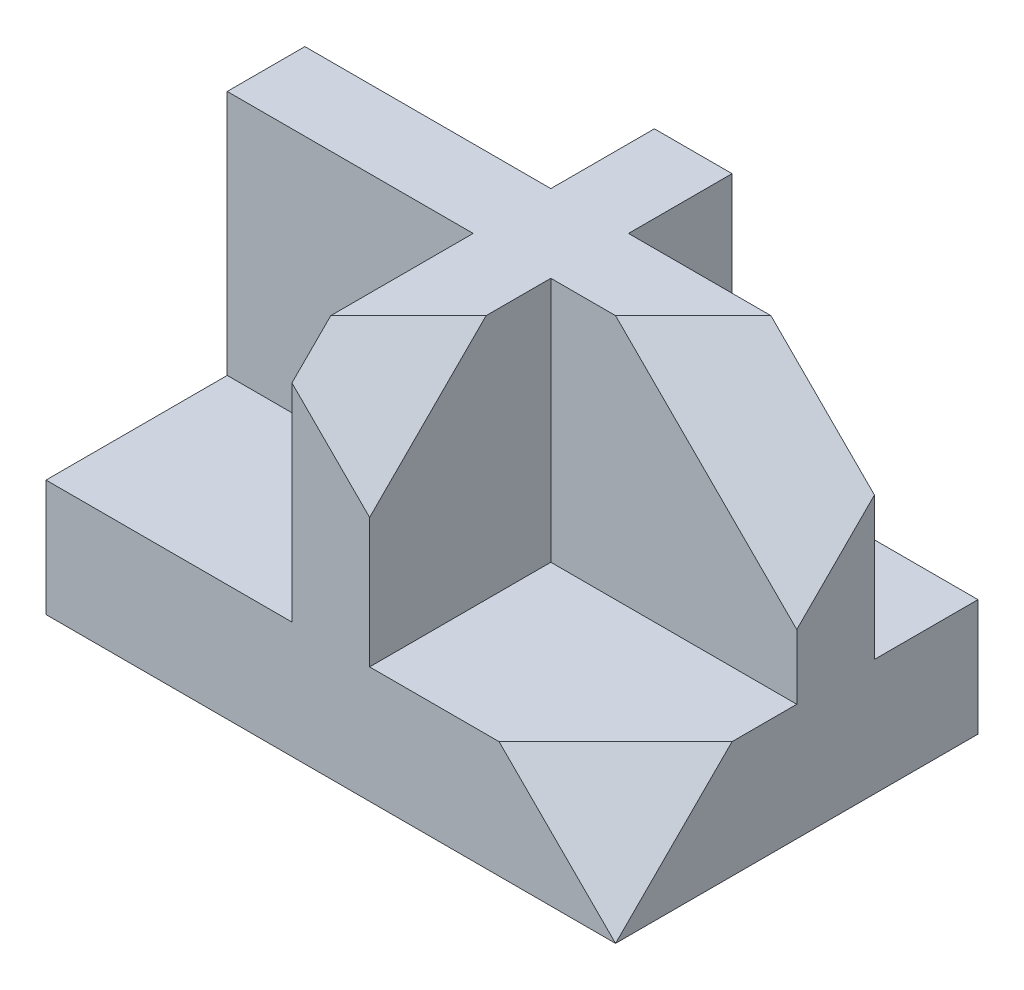
ISO-10303-21;
HEADER;
FILE_DESCRIPTION(('STEP AP214'),'2;1');
FILE_NAME('part.step','',(''),(''),'','','');
FILE_SCHEMA(('AUTOMOTIVE_DESIGN { 1 0 10303 214 1 1 1 1 }'));
ENDSEC;
DATA;
#1=APPLICATION_CONTEXT('core data for automotive mechanical design processes');
#2=APPLICATION_PROTOCOL_DEFINITION('international standard','automotive_design',2000,#1);
#3=PRODUCT_CONTEXT('',#1,'mechanical');
#4=PRODUCT('Part','Part','',(#3));
#5=PRODUCT_RELATED_PRODUCT_CATEGORY('part','',(#4));
#6=PRODUCT_DEFINITION_FORMATION('','',#4);
#7=PRODUCT_DEFINITION_CONTEXT('part definition',#1,'design');
#8=PRODUCT_DEFINITION('design','',#6,#7);
#9=PRODUCT_DEFINITION_SHAPE('','',#8);
#10=(LENGTH_UNIT() NAMED_UNIT(*) SI_UNIT(.MILLI.,.METRE.));
#11=(NAMED_UNIT(*) PLANE_ANGLE_UNIT() SI_UNIT($,.RADIAN.));
#12=(NAMED_UNIT(*) SI_UNIT($,.STERADIAN.) SOLID_ANGLE_UNIT());
#13=UNCERTAINTY_MEASURE_WITH_UNIT(LENGTH_MEASURE(1.E-05),#10,'distance_accuracy_value','');
#14=(GEOMETRIC_REPRESENTATION_CONTEXT(3) GLOBAL_UNCERTAINTY_ASSIGNED_CONTEXT((#13)) GLOBAL_UNIT_ASSIGNED_CONTEXT((#10,
#11,#12)) REPRESENTATION_CONTEXT('',''));
#15=CARTESIAN_POINT('',(0.,0.,0.));
#16=DIRECTION('',(0.,0.,1.));
#17=DIRECTION('',(1.,0.,0.));
#18=AXIS2_PLACEMENT_3D('',#15,#16,#17);
#19=CARTESIAN_POINT('',(0.,18.,0.));
#20=DIRECTION('',(0.,-1.,0.));
#21=DIRECTION('',(0.,0.,-1.));
#22=AXIS2_PLACEMENT_3D('',#19,#20,#21);
#23=PLANE('',#22);
#24=DIRECTION('',(-0.707106781186546,0.,0.707106781186549));
#25=VECTOR('',#24,1.);
#26=CARTESIAN_POINT('',(13.8800000000001,18.,13.88));
#27=LINE('',#26,#25);
#28=CARTESIAN_POINT('',(45.76,18.,-18.));
#29=VERTEX_POINT('',#28);
#30=CARTESIAN_POINT('',(27.76,18.,0.));
#31=VERTEX_POINT('',#30);
#32=EDGE_CURVE('E52',#29,#31,#27,.T.);
#33=ORIENTED_EDGE('',*,*,#32,.F.);
#34=DIRECTION('',(0.,0.,1.));
#35=VECTOR('',#34,1.);
#36=CARTESIAN_POINT('',(45.76,18.,-56.));
#37=LINE('',#36,#35);
#38=CARTESIAN_POINT('',(45.76,18.,-28.));
#39=VERTEX_POINT('',#38);
#40=EDGE_CURVE('E263',#39,#29,#37,.T.);
#41=ORIENTED_EDGE('',*,*,#40,.F.);
#42=DIRECTION('',(-1.,0.,0.));
#43=VECTOR('',#42,1.);
#44=CARTESIAN_POINT('',(0.,18.,-28.));
#45=LINE('',#44,#43);
#46=CARTESIAN_POINT('',(7.76,18.,-28.));
#47=VERTEX_POINT('',#46);
#48=EDGE_CURVE('E246',#39,#47,#45,.T.);
#49=ORIENTED_EDGE('',*,*,#48,.T.);
#50=DIRECTION('',(0.,0.,1.));
#51=VECTOR('',#50,1.);
#52=CARTESIAN_POINT('',(7.76,18.,0.));
#53=LINE('',#52,#51);
#54=CARTESIAN_POINT('',(7.76,18.,0.));
#55=VERTEX_POINT('',#54);
#56=EDGE_CURVE('E249',#47,#55,#53,.T.);
#57=ORIENTED_EDGE('',*,*,#56,.T.);
#58=DIRECTION('',(-1.,0.,0.));
#59=VECTOR('',#58,1.);
#60=CARTESIAN_POINT('',(45.76,18.,0.));
#61=LINE('',#60,#59);
#62=EDGE_CURVE('E264',#31,#55,#61,.T.);
#63=ORIENTED_EDGE('',*,*,#62,.F.);
#64=EDGE_LOOP('',(#33,#41,#49,#57,#63));
#65=FACE_BOUND('',#64,.T.);
#66=ADVANCED_FACE('F37',(#65),#23,.F.);
#67=CARTESIAN_POINT('',(45.76,18.,-56.));
#68=DIRECTION('',(1.,0.,0.));
#69=DIRECTION('',(0.,0.,-1.));
#70=AXIS2_PLACEMENT_3D('',#67,#68,#69);
#71=PLANE('',#70);
#72=DIRECTION('',(0.,-1.,0.));
#73=VECTOR('',#72,1.);
#74=CARTESIAN_POINT('',(45.76,56.,-40.));
#75=LINE('',#74,#73);
#76=CARTESIAN_POINT('',(45.76,40.,-40.));
#77=VERTEX_POINT('',#76);
#78=CARTESIAN_POINT('',(45.76,18.,-40.));
#79=VERTEX_POINT('',#78);
#80=EDGE_CURVE('E222',#77,#79,#75,.T.);
#81=ORIENTED_EDGE('',*,*,#80,.F.);
#82=DIRECTION('',(0.,-0.707106781186547,0.707106781186548));
#83=VECTOR('',#82,1.);
#84=CARTESIAN_POINT('',(45.76,37.,-37.));
#85=LINE('',#84,#83);
#86=CARTESIAN_POINT('',(45.76,28.,-28.));
#87=VERTEX_POINT('',#86);
#88=EDGE_CURVE('E179',#77,#87,#85,.T.);
#89=ORIENTED_EDGE('',*,*,#88,.T.);
#90=DIRECTION('',(0.,-1.,0.));
#91=VECTOR('',#90,1.);
#92=CARTESIAN_POINT('',(45.76,56.,-28.));
#93=LINE('',#92,#91);
#94=EDGE_CURVE('E178',#87,#39,#93,.T.);
#95=ORIENTED_EDGE('',*,*,#94,.T.);
#96=ORIENTED_EDGE('',*,*,#40,.T.);
#97=CARTESIAN_POINT('',(45.76,0.,0.));
#98=VERTEX_POINT('',#97);
#99=EDGE_CURVE('E308',#29,#98,#85,.T.);
#100=ORIENTED_EDGE('',*,*,#99,.T.);
#101=DIRECTION('',(0.,0.,1.));
#102=VECTOR('',#101,1.);
#103=CARTESIAN_POINT('',(45.76,0.,-56.));
#104=LINE('',#103,#102);
#105=CARTESIAN_POINT('',(45.76,0.,-56.));
#106=VERTEX_POINT('',#105);
#107=EDGE_CURVE('E258',#106,#98,#104,.T.);
#108=ORIENTED_EDGE('',*,*,#107,.F.);
#109=DIRECTION('',(0.,-1.,0.));
#110=VECTOR('',#109,1.);
#111=CARTESIAN_POINT('',(45.76,18.,-56.));
#112=LINE('',#111,#110);
#113=CARTESIAN_POINT('',(45.76,18.,-56.));
#114=VERTEX_POINT('',#113);
#115=EDGE_CURVE('E170',#114,#106,#112,.T.);
#116=ORIENTED_EDGE('',*,*,#115,.F.);
#117=EDGE_CURVE('E259',#114,#79,#37,.T.);
#118=ORIENTED_EDGE('',*,*,#117,.T.);
#119=EDGE_LOOP('',(#81,#89,#95,#96,#100,#108,#116,#118));
#120=FACE_BOUND('',#119,.T.);
#121=ADVANCED_FACE('F39',(#120),#71,.T.);
#122=CARTESIAN_POINT('',(45.76,18.,0.));
#123=DIRECTION('',(0.,0.,1.));
#124=DIRECTION('',(1.,0.,0.));
#125=AXIS2_PLACEMENT_3D('',#122,#123,#124);
#126=PLANE('',#125);
#127=DIRECTION('',(-1.,0.,0.));
#128=VECTOR('',#127,1.);
#129=CARTESIAN_POINT('',(45.76,0.,0.));
#130=LINE('',#129,#128);
#131=CARTESIAN_POINT('',(-42.24,0.,0.));
#132=VERTEX_POINT('',#131);
#133=EDGE_CURVE('E277',#98,#132,#130,.T.);
#134=ORIENTED_EDGE('',*,*,#133,.F.);
#135=DIRECTION('',(-0.707106781186546,0.707106781186548,0.));
#136=VECTOR('',#135,1.);
#137=CARTESIAN_POINT('',(36.76,9.00000000000002,0.));
#138=LINE('',#137,#136);
#139=EDGE_CURVE('E310',#98,#31,#138,.T.);
#140=ORIENTED_EDGE('',*,*,#139,.T.);
#141=ORIENTED_EDGE('',*,*,#62,.T.);
#142=DIRECTION('',(0.,-1.,0.));
#143=VECTOR('',#142,1.);
#144=CARTESIAN_POINT('',(7.76,56.,0.));
#145=LINE('',#144,#143);
#146=CARTESIAN_POINT('',(7.76,38.0000000000001,0.));
#147=VERTEX_POINT('',#146);
#148=EDGE_CURVE('E227',#147,#55,#145,.T.);
#149=ORIENTED_EDGE('',*,*,#148,.F.);
#150=CARTESIAN_POINT('',(-4.24,50.0000000000001,0.));
#151=VERTEX_POINT('',#150);
#152=EDGE_CURVE('E314',#147,#151,#138,.T.);
#153=ORIENTED_EDGE('',*,*,#152,.T.);
#154=DIRECTION('',(0.,-1.,0.));
#155=VECTOR('',#154,1.);
#156=CARTESIAN_POINT('',(-4.24,56.,0.));
#157=LINE('',#156,#155);
#158=CARTESIAN_POINT('',(-4.24,18.,0.));
#159=VERTEX_POINT('',#158);
#160=EDGE_CURVE('E230',#151,#159,#157,.T.);
#161=ORIENTED_EDGE('',*,*,#160,.T.);
#162=CARTESIAN_POINT('',(-42.24,18.,0.));
#163=VERTEX_POINT('',#162);
#164=EDGE_CURVE('E262',#159,#163,#61,.T.);
#165=ORIENTED_EDGE('',*,*,#164,.T.);
#166=DIRECTION('',(0.,-1.,0.));
#167=VECTOR('',#166,1.);
#168=CARTESIAN_POINT('',(-42.24,18.,0.));
#169=LINE('',#168,#167);
#170=EDGE_CURVE('E274',#163,#132,#169,.T.);
#171=ORIENTED_EDGE('',*,*,#170,.T.);
#172=EDGE_LOOP('',(#134,#140,#141,#149,#153,#161,#165,#171));
#173=FACE_BOUND('',#172,.T.);
#174=ADVANCED_FACE('F292',(#173),#126,.T.);
#175=CARTESIAN_POINT('',(-4.24,56.,0.));
#176=DIRECTION('',(1.,0.,0.));
#177=DIRECTION('',(0.,0.,-1.));
#178=AXIS2_PLACEMENT_3D('',#175,#176,#177);
#179=PLANE('',#178);
#180=DIRECTION('',(0.,-0.707106781186547,0.707106781186548));
#181=VECTOR('',#180,1.);
#182=CARTESIAN_POINT('',(-4.24,53.0000000000001,-2.99999999999993));
#183=LINE('',#182,#181);
#184=CARTESIAN_POINT('',(-4.24,56.,-5.99999999999987));
#185=VERTEX_POINT('',#184);
#186=EDGE_CURVE('E319',#185,#151,#183,.T.);
#187=ORIENTED_EDGE('',*,*,#186,.F.);
#188=DIRECTION('',(0.,0.,1.));
#189=VECTOR('',#188,1.);
#190=CARTESIAN_POINT('',(-4.24,56.,0.));
#191=LINE('',#190,#189);
#192=CARTESIAN_POINT('',(-4.24,56.,-28.));
#193=VERTEX_POINT('',#192);
#194=EDGE_CURVE('E190',#193,#185,#191,.T.);
#195=ORIENTED_EDGE('',*,*,#194,.F.);
#196=DIRECTION('',(0.,-1.,0.));
#197=VECTOR('',#196,1.);
#198=CARTESIAN_POINT('',(-4.24,56.,-28.));
#199=LINE('',#198,#197);
#200=CARTESIAN_POINT('',(-4.24,18.,-28.));
#201=VERTEX_POINT('',#200);
#202=EDGE_CURVE('E232',#193,#201,#199,.T.);
#203=ORIENTED_EDGE('',*,*,#202,.T.);
#204=DIRECTION('',(0.,0.,1.));
#205=VECTOR('',#204,1.);
#206=CARTESIAN_POINT('',(-4.24,18.,0.));
#207=LINE('',#206,#205);
#208=EDGE_CURVE('E252',#201,#159,#207,.T.);
#209=ORIENTED_EDGE('',*,*,#208,.T.);
#210=ORIENTED_EDGE('',*,*,#160,.F.);
#211=EDGE_LOOP('',(#187,#195,#203,#209,#210));
#212=FACE_BOUND('',#211,.T.);
#213=ADVANCED_FACE('F331',(#212),#179,.F.);
#214=CARTESIAN_POINT('',(7.76,56.,0.));
#215=DIRECTION('',(1.,0.,0.));
#216=DIRECTION('',(0.,0.,-1.));
#217=AXIS2_PLACEMENT_3D('',#214,#215,#216);
#218=PLANE('',#217);
#219=DIRECTION('',(0.,0.,1.));
#220=VECTOR('',#219,1.);
#221=CARTESIAN_POINT('',(7.76,56.,0.));
#222=LINE('',#221,#220);
#223=CARTESIAN_POINT('',(7.76,56.,-28.));
#224=VERTEX_POINT('',#223);
#225=CARTESIAN_POINT('',(7.76,56.,-17.9999999999999));
#226=VERTEX_POINT('',#225);
#227=EDGE_CURVE('E185',#224,#226,#222,.T.);
#228=ORIENTED_EDGE('',*,*,#227,.T.);
#229=DIRECTION('',(0.,-0.707106781186547,0.707106781186548));
#230=VECTOR('',#229,1.);
#231=CARTESIAN_POINT('',(7.76,47.,-8.99999999999995));
#232=LINE('',#231,#230);
#233=EDGE_CURVE('E317',#226,#147,#232,.T.);
#234=ORIENTED_EDGE('',*,*,#233,.T.);
#235=ORIENTED_EDGE('',*,*,#148,.T.);
#236=ORIENTED_EDGE('',*,*,#56,.F.);
#237=DIRECTION('',(0.,-1.,0.));
#238=VECTOR('',#237,1.);
#239=CARTESIAN_POINT('',(7.76,56.,-28.));
#240=LINE('',#239,#238);
#241=EDGE_CURVE('E225',#224,#47,#240,.T.);
#242=ORIENTED_EDGE('',*,*,#241,.F.);
#243=EDGE_LOOP('',(#228,#234,#235,#236,#242));
#244=FACE_BOUND('',#243,.T.);
#245=ADVANCED_FACE('F337',(#244),#218,.T.);
#246=CARTESIAN_POINT('',(0.,56.,-28.));
#247=DIRECTION('',(0.,0.,1.));
#248=DIRECTION('',(1.,0.,0.));
#249=AXIS2_PLACEMENT_3D('',#246,#247,#248);
#250=PLANE('',#249);
#251=ORIENTED_EDGE('',*,*,#94,.F.);
#252=DIRECTION('',(-0.707106781186547,0.707106781186548,0.));
#253=VECTOR('',#252,1.);
#254=CARTESIAN_POINT('',(8.88000000000005,64.88,-28.));
#255=LINE('',#254,#253);
#256=CARTESIAN_POINT('',(17.7600000000001,56.,-28.));
#257=VERTEX_POINT('',#256);
#258=EDGE_CURVE('E164',#87,#257,#255,.T.);
#259=ORIENTED_EDGE('',*,*,#258,.T.);
#260=DIRECTION('',(-1.,0.,0.));
#261=VECTOR('',#260,1.);
#262=CARTESIAN_POINT('',(0.,56.,-28.));
#263=LINE('',#262,#261);
#264=EDGE_CURVE('E175',#257,#224,#263,.T.);
#265=ORIENTED_EDGE('',*,*,#264,.T.);
#266=ORIENTED_EDGE('',*,*,#241,.T.);
#267=ORIENTED_EDGE('',*,*,#48,.F.);
#268=EDGE_LOOP('',(#251,#259,#265,#266,#267));
#269=FACE_BOUND('',#268,.T.);
#270=ADVANCED_FACE('F173',(#269),#250,.T.);
#271=CARTESIAN_POINT('',(0.,56.,-40.));
#272=DIRECTION('',(0.,0.,-1.));
#273=DIRECTION('',(-1.,0.,0.));
#274=AXIS2_PLACEMENT_3D('',#271,#272,#273);
#275=PLANE('',#274);
#276=DIRECTION('',(1.,0.,0.));
#277=VECTOR('',#276,1.);
#278=CARTESIAN_POINT('',(0.,56.,-40.));
#279=LINE('',#278,#277);
#280=CARTESIAN_POINT('',(7.75999999999999,56.,-40.));
#281=VERTEX_POINT('',#280);
#282=CARTESIAN_POINT('',(29.76,56.,-40.));
#283=VERTEX_POINT('',#282);
#284=EDGE_CURVE('E186',#281,#283,#279,.T.);
#285=ORIENTED_EDGE('',*,*,#284,.T.);
#286=DIRECTION('',(0.707106781186546,-0.707106781186548,0.));
#287=VECTOR('',#286,1.);
#288=CARTESIAN_POINT('',(14.8800000000001,70.88,-40.));
#289=LINE('',#288,#287);
#290=EDGE_CURVE('E60',#283,#77,#289,.T.);
#291=ORIENTED_EDGE('',*,*,#290,.T.);
#292=ORIENTED_EDGE('',*,*,#80,.T.);
#293=DIRECTION('',(1.,0.,0.));
#294=VECTOR('',#293,1.);
#295=CARTESIAN_POINT('',(0.,18.,-40.));
#296=LINE('',#295,#294);
#297=CARTESIAN_POINT('',(7.75999999999999,18.,-40.));
#298=VERTEX_POINT('',#297);
#299=EDGE_CURVE('E243',#298,#79,#296,.T.);
#300=ORIENTED_EDGE('',*,*,#299,.F.);
#301=DIRECTION('',(0.,-1.,0.));
#302=VECTOR('',#301,1.);
#303=CARTESIAN_POINT('',(7.75999999999999,56.,-40.));
#304=LINE('',#303,#302);
#305=EDGE_CURVE('E219',#281,#298,#304,.T.);
#306=ORIENTED_EDGE('',*,*,#305,.F.);
#307=EDGE_LOOP('',(#285,#291,#292,#300,#306));
#308=FACE_BOUND('',#307,.T.);
#309=ADVANCED_FACE('F376',(#308),#275,.T.);
#310=CARTESIAN_POINT('',(0.,56.,0.));
#311=DIRECTION('',(0.,1.,0.));
#312=DIRECTION('',(0.,0.,1.));
#313=AXIS2_PLACEMENT_3D('',#310,#311,#312);
#314=PLANE('',#313);
#315=ORIENTED_EDGE('',*,*,#194,.T.);
#316=DIRECTION('',(0.707106781186546,0.,-0.707106781186549));
#317=VECTOR('',#316,1.);
#318=CARTESIAN_POINT('',(-5.11999999999994,56.,-5.11999999999993));
#319=LINE('',#318,#317);
#320=EDGE_CURVE('E11',#185,#226,#319,.T.);
#321=ORIENTED_EDGE('',*,*,#320,.T.);
#322=ORIENTED_EDGE('',*,*,#227,.F.);
#323=ORIENTED_EDGE('',*,*,#264,.F.);
#324=EDGE_CURVE('E41',#257,#283,#319,.T.);
#325=ORIENTED_EDGE('',*,*,#324,.T.);
#326=ORIENTED_EDGE('',*,*,#284,.F.);
#327=DIRECTION('',(0.,0.,1.));
#328=VECTOR('',#327,1.);
#329=CARTESIAN_POINT('',(7.76,56.,0.));
#330=LINE('',#329,#328);
#331=CARTESIAN_POINT('',(7.76,56.,-56.));
#332=VERTEX_POINT('',#331);
#333=EDGE_CURVE('E188',#332,#281,#330,.T.);
#334=ORIENTED_EDGE('',*,*,#333,.F.);
#335=DIRECTION('',(1.,0.,0.));
#336=VECTOR('',#335,1.);
#337=CARTESIAN_POINT('',(0.,56.,-56.));
#338=LINE('',#337,#336);
#339=CARTESIAN_POINT('',(-4.24,56.,-56.));
#340=VERTEX_POINT('',#339);
#341=EDGE_CURVE('E196',#340,#332,#338,.T.);
#342=ORIENTED_EDGE('',*,*,#341,.F.);
#343=DIRECTION('',(0.,0.,1.));
#344=VECTOR('',#343,1.);
#345=CARTESIAN_POINT('',(-4.24,56.,0.));
#346=LINE('',#345,#344);
#347=CARTESIAN_POINT('',(-4.24000000000001,56.,-40.));
#348=VERTEX_POINT('',#347);
#349=EDGE_CURVE('E199',#340,#348,#346,.T.);
#350=ORIENTED_EDGE('',*,*,#349,.T.);
#351=DIRECTION('',(1.,0.,0.));
#352=VECTOR('',#351,1.);
#353=CARTESIAN_POINT('',(0.,56.,-40.));
#354=LINE('',#353,#352);
#355=CARTESIAN_POINT('',(-42.24,56.,-40.));
#356=VERTEX_POINT('',#355);
#357=EDGE_CURVE('E201',#356,#348,#354,.T.);
#358=ORIENTED_EDGE('',*,*,#357,.F.);
#359=DIRECTION('',(0.,0.,-1.));
#360=VECTOR('',#359,1.);
#361=CARTESIAN_POINT('',(-42.24,56.,0.));
#362=LINE('',#361,#360);
#363=CARTESIAN_POINT('',(-42.24,56.,-28.));
#364=VERTEX_POINT('',#363);
#365=EDGE_CURVE('E204',#364,#356,#362,.T.);
#366=ORIENTED_EDGE('',*,*,#365,.F.);
#367=DIRECTION('',(-1.,0.,0.));
#368=VECTOR('',#367,1.);
#369=CARTESIAN_POINT('',(0.,56.,-28.));
#370=LINE('',#369,#368);
#371=EDGE_CURVE('E312',#193,#364,#370,.T.);
#372=ORIENTED_EDGE('',*,*,#371,.F.);
#373=EDGE_LOOP('',(#315,#321,#322,#323,#325,#326,#334,#342,#350,#358,#366,#372));
#374=FACE_BOUND('',#373,.T.);
#375=ADVANCED_FACE('F183',(#374),#314,.T.);
#376=ORIENTED_EDGE('',*,*,#208,.F.);
#377=DIRECTION('',(-1.,0.,0.));
#378=VECTOR('',#377,1.);
#379=CARTESIAN_POINT('',(0.,18.,-28.));
#380=LINE('',#379,#378);
#381=CARTESIAN_POINT('',(-42.24,18.,-28.));
#382=VERTEX_POINT('',#381);
#383=EDGE_CURVE('E255',#201,#382,#380,.T.);
#384=ORIENTED_EDGE('',*,*,#383,.T.);
#385=DIRECTION('',(0.,0.,-1.));
#386=VECTOR('',#385,1.);
#387=CARTESIAN_POINT('',(-42.24,18.,0.));
#388=LINE('',#387,#386);
#389=EDGE_CURVE('E267',#163,#382,#388,.T.);
#390=ORIENTED_EDGE('',*,*,#389,.F.);
#391=ORIENTED_EDGE('',*,*,#164,.F.);
#392=EDGE_LOOP('',(#376,#384,#390,#391));
#393=FACE_BOUND('',#392,.T.);
#394=ADVANCED_FACE('F341',(#393),#23,.F.);
#395=DIRECTION('',(0.,0.,1.));
#396=VECTOR('',#395,1.);
#397=CARTESIAN_POINT('',(-4.24,18.,0.));
#398=LINE('',#397,#396);
#399=CARTESIAN_POINT('',(-4.24,18.,-56.));
#400=VERTEX_POINT('',#399);
#401=CARTESIAN_POINT('',(-4.24000000000001,18.,-40.));
#402=VERTEX_POINT('',#401);
#403=EDGE_CURVE('E238',#400,#402,#398,.T.);
#404=ORIENTED_EDGE('',*,*,#403,.F.);
#405=DIRECTION('',(1.,0.,0.));
#406=VECTOR('',#405,1.);
#407=CARTESIAN_POINT('',(-42.24,18.,-56.));
#408=LINE('',#407,#406);
#409=CARTESIAN_POINT('',(-42.24,18.,-56.));
#410=VERTEX_POINT('',#409);
#411=EDGE_CURVE('E271',#410,#400,#408,.T.);
#412=ORIENTED_EDGE('',*,*,#411,.F.);
#413=CARTESIAN_POINT('',(-42.24,18.,-40.));
#414=VERTEX_POINT('',#413);
#415=EDGE_CURVE('E266',#414,#410,#388,.T.);
#416=ORIENTED_EDGE('',*,*,#415,.F.);
#417=DIRECTION('',(1.,0.,0.));
#418=VECTOR('',#417,1.);
#419=CARTESIAN_POINT('',(0.,18.,-40.));
#420=LINE('',#419,#418);
#421=EDGE_CURVE('E235',#414,#402,#420,.T.);
#422=ORIENTED_EDGE('',*,*,#421,.T.);
#423=EDGE_LOOP('',(#404,#412,#416,#422));
#424=FACE_BOUND('',#423,.T.);
#425=ADVANCED_FACE('F349',(#424),#23,.F.);
#426=CARTESIAN_POINT('',(-42.24,18.,-56.));
#427=DIRECTION('',(0.,0.,-1.));
#428=DIRECTION('',(-1.,0.,0.));
#429=AXIS2_PLACEMENT_3D('',#426,#427,#428);
#430=PLANE('',#429);
#431=ORIENTED_EDGE('',*,*,#115,.T.);
#432=DIRECTION('',(1.,0.,0.));
#433=VECTOR('',#432,1.);
#434=CARTESIAN_POINT('',(-42.24,0.,-56.));
#435=LINE('',#434,#433);
#436=CARTESIAN_POINT('',(-42.24,0.,-56.));
#437=VERTEX_POINT('',#436);
#438=EDGE_CURVE('E281',#437,#106,#435,.T.);
#439=ORIENTED_EDGE('',*,*,#438,.F.);
#440=DIRECTION('',(0.,-1.,0.));
#441=VECTOR('',#440,1.);
#442=CARTESIAN_POINT('',(-42.24,18.,-56.));
#443=LINE('',#442,#441);
#444=EDGE_CURVE('E285',#410,#437,#443,.T.);
#445=ORIENTED_EDGE('',*,*,#444,.F.);
#446=ORIENTED_EDGE('',*,*,#411,.T.);
#447=DIRECTION('',(0.,-1.,0.));
#448=VECTOR('',#447,1.);
#449=CARTESIAN_POINT('',(-4.24,56.,-56.));
#450=LINE('',#449,#448);
#451=EDGE_CURVE('E214',#340,#400,#450,.T.);
#452=ORIENTED_EDGE('',*,*,#451,.F.);
#453=ORIENTED_EDGE('',*,*,#341,.T.);
#454=DIRECTION('',(0.,-1.,0.));
#455=VECTOR('',#454,1.);
#456=CARTESIAN_POINT('',(7.76,56.,-56.));
#457=LINE('',#456,#455);
#458=CARTESIAN_POINT('',(7.76,18.,-56.));
#459=VERTEX_POINT('',#458);
#460=EDGE_CURVE('E216',#332,#459,#457,.T.);
#461=ORIENTED_EDGE('',*,*,#460,.T.);
#462=EDGE_CURVE('E270',#459,#114,#408,.T.);
#463=ORIENTED_EDGE('',*,*,#462,.T.);
#464=EDGE_LOOP('',(#431,#439,#445,#446,#452,#453,#461,#463));
#465=FACE_BOUND('',#464,.T.);
#466=ADVANCED_FACE('F358',(#465),#430,.T.);
#467=CARTESIAN_POINT('',(-42.24,18.,0.));
#468=DIRECTION('',(-1.,0.,0.));
#469=DIRECTION('',(0.,0.,1.));
#470=AXIS2_PLACEMENT_3D('',#467,#468,#469);
#471=PLANE('',#470);
#472=ORIENTED_EDGE('',*,*,#444,.T.);
#473=DIRECTION('',(0.,0.,-1.));
#474=VECTOR('',#473,1.);
#475=CARTESIAN_POINT('',(-42.24,0.,0.));
#476=LINE('',#475,#474);
#477=EDGE_CURVE('E279',#132,#437,#476,.T.);
#478=ORIENTED_EDGE('',*,*,#477,.F.);
#479=ORIENTED_EDGE('',*,*,#170,.F.);
#480=ORIENTED_EDGE('',*,*,#389,.T.);
#481=DIRECTION('',(0.,-1.,0.));
#482=VECTOR('',#481,1.);
#483=CARTESIAN_POINT('',(-42.24,56.,-28.));
#484=LINE('',#483,#482);
#485=EDGE_CURVE('E207',#364,#382,#484,.T.);
#486=ORIENTED_EDGE('',*,*,#485,.F.);
#487=ORIENTED_EDGE('',*,*,#365,.T.);
#488=DIRECTION('',(0.,-1.,0.));
#489=VECTOR('',#488,1.);
#490=CARTESIAN_POINT('',(-42.24,56.,-40.));
#491=LINE('',#490,#489);
#492=EDGE_CURVE('E209',#356,#414,#491,.T.);
#493=ORIENTED_EDGE('',*,*,#492,.T.);
#494=ORIENTED_EDGE('',*,*,#415,.T.);
#495=EDGE_LOOP('',(#472,#478,#479,#480,#486,#487,#493,#494));
#496=FACE_BOUND('',#495,.T.);
#497=ADVANCED_FACE('F296',(#496),#471,.T.);
#498=DIRECTION('',(0.,0.,1.));
#499=VECTOR('',#498,1.);
#500=CARTESIAN_POINT('',(7.76,18.,0.));
#501=LINE('',#500,#499);
#502=EDGE_CURVE('E240',#459,#298,#501,.T.);
#503=ORIENTED_EDGE('',*,*,#502,.T.);
#504=ORIENTED_EDGE('',*,*,#299,.T.);
#505=ORIENTED_EDGE('',*,*,#117,.F.);
#506=ORIENTED_EDGE('',*,*,#462,.F.);
#507=EDGE_LOOP('',(#503,#504,#505,#506));
#508=FACE_BOUND('',#507,.T.);
#509=ADVANCED_FACE('F342',(#508),#23,.F.);
#510=CARTESIAN_POINT('',(0.,0.,0.));
#511=DIRECTION('',(0.,-1.,0.));
#512=DIRECTION('',(0.,0.,-1.));
#513=AXIS2_PLACEMENT_3D('',#510,#511,#512);
#514=PLANE('',#513);
#515=ORIENTED_EDGE('',*,*,#477,.T.);
#516=ORIENTED_EDGE('',*,*,#438,.T.);
#517=ORIENTED_EDGE('',*,*,#107,.T.);
#518=ORIENTED_EDGE('',*,*,#133,.T.);
#519=EDGE_LOOP('',(#515,#516,#517,#518));
#520=FACE_BOUND('',#519,.T.);
#521=ADVANCED_FACE('F300',(#520),#514,.T.);
#522=CARTESIAN_POINT('',(0.,56.,-28.));
#523=DIRECTION('',(0.,0.,1.));
#524=DIRECTION('',(1.,0.,0.));
#525=AXIS2_PLACEMENT_3D('',#522,#523,#524);
#526=PLANE('',#525);
#527=ORIENTED_EDGE('',*,*,#383,.F.);
#528=ORIENTED_EDGE('',*,*,#202,.F.);
#529=ORIENTED_EDGE('',*,*,#371,.T.);
#530=ORIENTED_EDGE('',*,*,#485,.T.);
#531=EDGE_LOOP('',(#527,#528,#529,#530));
#532=FACE_BOUND('',#531,.T.);
#533=ADVANCED_FACE('F357',(#532),#526,.T.);
#534=CARTESIAN_POINT('',(7.76,56.,0.));
#535=DIRECTION('',(1.,0.,0.));
#536=DIRECTION('',(0.,0.,-1.));
#537=AXIS2_PLACEMENT_3D('',#534,#535,#536);
#538=PLANE('',#537);
#539=ORIENTED_EDGE('',*,*,#502,.F.);
#540=ORIENTED_EDGE('',*,*,#460,.F.);
#541=ORIENTED_EDGE('',*,*,#333,.T.);
#542=ORIENTED_EDGE('',*,*,#305,.T.);
#543=EDGE_LOOP('',(#539,#540,#541,#542));
#544=FACE_BOUND('',#543,.T.);
#545=ADVANCED_FACE('F381',(#544),#538,.T.);
#546=CARTESIAN_POINT('',(-4.24,56.,0.));
#547=DIRECTION('',(1.,0.,0.));
#548=DIRECTION('',(0.,0.,-1.));
#549=AXIS2_PLACEMENT_3D('',#546,#547,#548);
#550=PLANE('',#549);
#551=ORIENTED_EDGE('',*,*,#451,.T.);
#552=ORIENTED_EDGE('',*,*,#403,.T.);
#553=DIRECTION('',(0.,-1.,0.));
#554=VECTOR('',#553,1.);
#555=CARTESIAN_POINT('',(-4.24000000000001,56.,-40.));
#556=LINE('',#555,#554);
#557=EDGE_CURVE('E211',#348,#402,#556,.T.);
#558=ORIENTED_EDGE('',*,*,#557,.F.);
#559=ORIENTED_EDGE('',*,*,#349,.F.);
#560=EDGE_LOOP('',(#551,#552,#558,#559));
#561=FACE_BOUND('',#560,.T.);
#562=ADVANCED_FACE('F383',(#561),#550,.F.);
#563=CARTESIAN_POINT('',(0.,56.,-40.));
#564=DIRECTION('',(0.,0.,-1.));
#565=DIRECTION('',(-1.,0.,0.));
#566=AXIS2_PLACEMENT_3D('',#563,#564,#565);
#567=PLANE('',#566);
#568=ORIENTED_EDGE('',*,*,#421,.F.);
#569=ORIENTED_EDGE('',*,*,#492,.F.);
#570=ORIENTED_EDGE('',*,*,#357,.T.);
#571=ORIENTED_EDGE('',*,*,#557,.T.);
#572=EDGE_LOOP('',(#568,#569,#570,#571));
#573=FACE_BOUND('',#572,.T.);
#574=ADVANCED_FACE('F389',(#573),#567,.T.);
#575=CARTESIAN_POINT('',(15.2533333333334,15.2533333333333,15.2533333333333));
#576=DIRECTION('',(0.577350269189627,0.577350269189625,0.577350269189625));
#577=DIRECTION('',(-0.707106781186546,0.707106781186548,0.));
#578=AXIS2_PLACEMENT_3D('',#575,#576,#577);
#579=PLANE('',#578);
#580=ORIENTED_EDGE('',*,*,#290,.F.);
#581=ORIENTED_EDGE('',*,*,#324,.F.);
#582=ORIENTED_EDGE('',*,*,#258,.F.);
#583=ORIENTED_EDGE('',*,*,#88,.F.);
#584=EDGE_LOOP('',(#580,#581,#582,#583));
#585=FACE_BOUND('',#584,.T.);
#586=ADVANCED_FACE('F163',(#585),#579,.T.);
#587=ORIENTED_EDGE('',*,*,#233,.F.);
#588=ORIENTED_EDGE('',*,*,#320,.F.);
#589=ORIENTED_EDGE('',*,*,#186,.T.);
#590=ORIENTED_EDGE('',*,*,#152,.F.);
#591=EDGE_LOOP('',(#587,#588,#589,#590));
#592=FACE_BOUND('',#591,.T.);
#593=ADVANCED_FACE('F335',(#592),#579,.T.);
#594=ORIENTED_EDGE('',*,*,#32,.T.);
#595=ORIENTED_EDGE('',*,*,#139,.F.);
#596=ORIENTED_EDGE('',*,*,#99,.F.);
#597=EDGE_LOOP('',(#594,#595,#596));
#598=FACE_BOUND('',#597,.T.);
#599=ADVANCED_FACE('F527',(#598),#579,.T.);
#600=CLOSED_SHELL('',(#66,#121,#174,#213,#245,#270,#309,#375,#394,#425,#466,#497,#509,#521,#533,
#545,#562,#574,#586,#593,#599));
#601=MANIFOLD_SOLID_BREP('B2',#600);
#602=ADVANCED_BREP_SHAPE_REPRESENTATION('',(#18,#601),#14);
#603=SHAPE_DEFINITION_REPRESENTATION(#9,#602);
ENDSEC;
END-ISO-10303-21;
